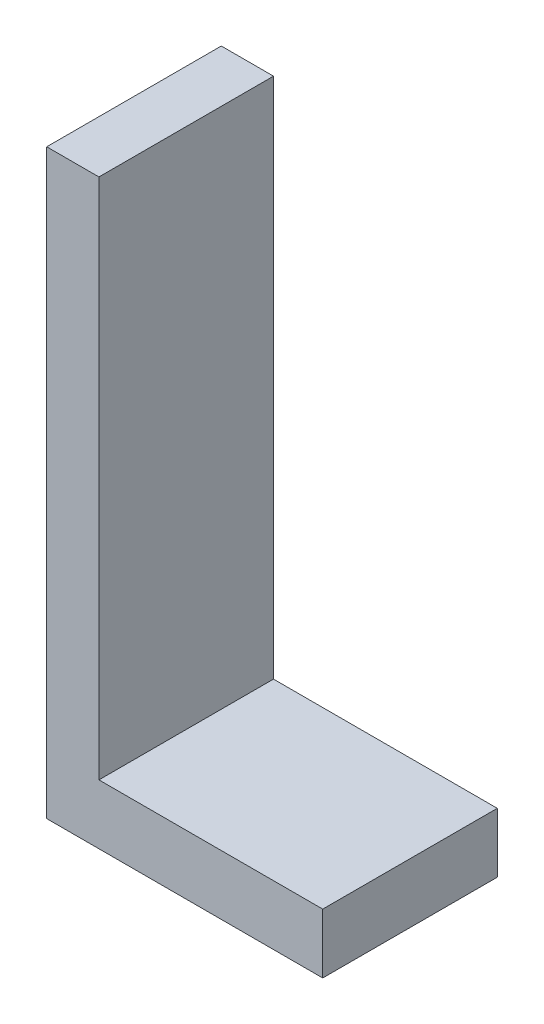
ISO-10303-21;
HEADER;
FILE_DESCRIPTION(('STEP AP214'),'2;1');
FILE_NAME('part.step','',(''),(''),'','','');
FILE_SCHEMA(('AUTOMOTIVE_DESIGN { 1 0 10303 214 1 1 1 1 }'));
ENDSEC;
DATA;
#1=APPLICATION_CONTEXT('core data for automotive mechanical design processes');
#2=APPLICATION_PROTOCOL_DEFINITION('international standard','automotive_design',2000,#1);
#3=PRODUCT_CONTEXT('',#1,'mechanical');
#4=PRODUCT('Part','Part','',(#3));
#5=PRODUCT_RELATED_PRODUCT_CATEGORY('part','',(#4));
#6=PRODUCT_DEFINITION_FORMATION('','',#4);
#7=PRODUCT_DEFINITION_CONTEXT('part definition',#1,'design');
#8=PRODUCT_DEFINITION('design','',#6,#7);
#9=PRODUCT_DEFINITION_SHAPE('','',#8);
#10=(LENGTH_UNIT() NAMED_UNIT(*) SI_UNIT(.MILLI.,.METRE.));
#11=(NAMED_UNIT(*) PLANE_ANGLE_UNIT() SI_UNIT($,.RADIAN.));
#12=(NAMED_UNIT(*) SI_UNIT($,.STERADIAN.) SOLID_ANGLE_UNIT());
#13=UNCERTAINTY_MEASURE_WITH_UNIT(LENGTH_MEASURE(1.E-05),#10,'distance_accuracy_value','');
#14=(GEOMETRIC_REPRESENTATION_CONTEXT(3) GLOBAL_UNCERTAINTY_ASSIGNED_CONTEXT((#13)) GLOBAL_UNIT_ASSIGNED_CONTEXT((#10,
#11,#12)) REPRESENTATION_CONTEXT('',''));
#15=CARTESIAN_POINT('',(0.,0.,0.));
#16=DIRECTION('',(0.,0.,1.));
#17=DIRECTION('',(1.,0.,0.));
#18=AXIS2_PLACEMENT_3D('',#15,#16,#17);
#19=CARTESIAN_POINT('',(-55.4324653258695,-22.8701190762308,1.5));
#20=DIRECTION('',(-1.,0.,0.));
#21=DIRECTION('',(0.,0.,1.));
#22=AXIS2_PLACEMENT_3D('',#19,#20,#21);
#23=PLANE('',#22);
#24=DIRECTION('',(0.,1.,0.));
#25=VECTOR('',#24,1.);
#26=CARTESIAN_POINT('',(-55.4324653258695,-22.8701190762308,0.));
#27=LINE('',#26,#25);
#28=CARTESIAN_POINT('',(-55.4324653258695,-22.8701190762308,0.));
#29=VERTEX_POINT('',#28);
#30=CARTESIAN_POINT('',(-55.4324653258695,-17.8701190762308,0.));
#31=VERTEX_POINT('',#30);
#32=EDGE_CURVE('E118',#29,#31,#27,.T.);
#33=ORIENTED_EDGE('',*,*,#32,.F.);
#34=DIRECTION('',(0.,0.,-1.));
#35=VECTOR('',#34,1.);
#36=CARTESIAN_POINT('',(-55.4324653258695,-22.8701190762308,1.5));
#37=LINE('',#36,#35);
#38=CARTESIAN_POINT('',(-55.4324653258695,-22.8701190762308,1.5));
#39=VERTEX_POINT('',#38);
#40=EDGE_CURVE('E11',#39,#29,#37,.T.);
#41=ORIENTED_EDGE('',*,*,#40,.F.);
#42=DIRECTION('',(0.,1.,0.));
#43=VECTOR('',#42,1.);
#44=CARTESIAN_POINT('',(-55.4324653258695,-22.8701190762308,1.5));
#45=LINE('',#44,#43);
#46=CARTESIAN_POINT('',(-55.4324653258695,-17.8701190762308,1.5));
#47=VERTEX_POINT('',#46);
#48=EDGE_CURVE('E132',#39,#47,#45,.T.);
#49=ORIENTED_EDGE('',*,*,#48,.T.);
#50=DIRECTION('',(0.,0.,-1.));
#51=VECTOR('',#50,1.);
#52=CARTESIAN_POINT('',(-55.4324653258695,-17.8701190762308,1.5));
#53=LINE('',#52,#51);
#54=EDGE_CURVE('E36',#47,#31,#53,.T.);
#55=ORIENTED_EDGE('',*,*,#54,.T.);
#56=EDGE_LOOP('',(#33,#41,#49,#55));
#57=FACE_BOUND('',#56,.T.);
#58=ADVANCED_FACE('F33',(#57),#23,.T.);
#59=CARTESIAN_POINT('',(-53.0606704540747,-22.8701190762308,1.5));
#60=DIRECTION('',(0.,-1.,0.));
#61=DIRECTION('',(0.,0.,-1.));
#62=AXIS2_PLACEMENT_3D('',#59,#60,#61);
#63=PLANE('',#62);
#64=DIRECTION('',(-1.,0.,0.));
#65=VECTOR('',#64,1.);
#66=CARTESIAN_POINT('',(-53.0606704540747,-22.8701190762308,0.));
#67=LINE('',#66,#65);
#68=CARTESIAN_POINT('',(-53.0606704540747,-22.8701190762308,0.));
#69=VERTEX_POINT('',#68);
#70=EDGE_CURVE('E130',#69,#29,#67,.T.);
#71=ORIENTED_EDGE('',*,*,#70,.F.);
#72=DIRECTION('',(0.,0.,-1.));
#73=VECTOR('',#72,1.);
#74=CARTESIAN_POINT('',(-53.0606704540747,-22.8701190762308,1.5));
#75=LINE('',#74,#73);
#76=CARTESIAN_POINT('',(-53.0606704540747,-22.8701190762308,1.5));
#77=VERTEX_POINT('',#76);
#78=EDGE_CURVE('E42',#77,#69,#75,.T.);
#79=ORIENTED_EDGE('',*,*,#78,.F.);
#80=DIRECTION('',(-1.,0.,0.));
#81=VECTOR('',#80,1.);
#82=CARTESIAN_POINT('',(-53.0606704540747,-22.8701190762308,1.5));
#83=LINE('',#82,#81);
#84=EDGE_CURVE('E108',#77,#39,#83,.T.);
#85=ORIENTED_EDGE('',*,*,#84,.T.);
#86=ORIENTED_EDGE('',*,*,#40,.T.);
#87=EDGE_LOOP('',(#71,#79,#85,#86));
#88=FACE_BOUND('',#87,.T.);
#89=ADVANCED_FACE('F140',(#88),#63,.T.);
#90=CARTESIAN_POINT('',(-53.0606704540747,-22.3572985634103,1.5));
#91=DIRECTION('',(1.,0.,0.));
#92=DIRECTION('',(0.,0.,-1.));
#93=AXIS2_PLACEMENT_3D('',#90,#91,#92);
#94=PLANE('',#93);
#95=DIRECTION('',(0.,-1.,0.));
#96=VECTOR('',#95,1.);
#97=CARTESIAN_POINT('',(-53.0606704540747,-22.3572985634103,0.));
#98=LINE('',#97,#96);
#99=CARTESIAN_POINT('',(-53.0606704540747,-22.3572985634103,0.));
#100=VERTEX_POINT('',#99);
#101=EDGE_CURVE('E95',#100,#69,#98,.T.);
#102=ORIENTED_EDGE('',*,*,#101,.F.);
#103=DIRECTION('',(0.,0.,-1.));
#104=VECTOR('',#103,1.);
#105=CARTESIAN_POINT('',(-53.0606704540747,-22.3572985634103,1.5));
#106=LINE('',#105,#104);
#107=CARTESIAN_POINT('',(-53.0606704540747,-22.3572985634103,1.5));
#108=VERTEX_POINT('',#107);
#109=EDGE_CURVE('E90',#108,#100,#106,.T.);
#110=ORIENTED_EDGE('',*,*,#109,.F.);
#111=DIRECTION('',(0.,-1.,0.));
#112=VECTOR('',#111,1.);
#113=CARTESIAN_POINT('',(-53.0606704540747,-22.3572985634103,1.5));
#114=LINE('',#113,#112);
#115=EDGE_CURVE('E93',#108,#77,#114,.T.);
#116=ORIENTED_EDGE('',*,*,#115,.T.);
#117=ORIENTED_EDGE('',*,*,#78,.T.);
#118=EDGE_LOOP('',(#102,#110,#116,#117));
#119=FACE_BOUND('',#118,.T.);
#120=ADVANCED_FACE('F92',(#119),#94,.T.);
#121=CARTESIAN_POINT('',(-54.9837473771516,-22.3572985634103,1.5));
#122=DIRECTION('',(0.,1.,0.));
#123=DIRECTION('',(0.,0.,1.));
#124=AXIS2_PLACEMENT_3D('',#121,#122,#123);
#125=PLANE('',#124);
#126=DIRECTION('',(1.,0.,0.));
#127=VECTOR('',#126,1.);
#128=CARTESIAN_POINT('',(-54.9837473771516,-22.3572985634103,0.));
#129=LINE('',#128,#127);
#130=CARTESIAN_POINT('',(-54.9837473771516,-22.3572985634103,0.));
#131=VERTEX_POINT('',#130);
#132=EDGE_CURVE('E127',#131,#100,#129,.T.);
#133=ORIENTED_EDGE('',*,*,#132,.F.);
#134=DIRECTION('',(0.,0.,-1.));
#135=VECTOR('',#134,1.);
#136=CARTESIAN_POINT('',(-54.9837473771516,-22.3572985634103,1.5));
#137=LINE('',#136,#135);
#138=CARTESIAN_POINT('',(-54.9837473771516,-22.3572985634103,1.5));
#139=VERTEX_POINT('',#138);
#140=EDGE_CURVE('E100',#139,#131,#137,.T.);
#141=ORIENTED_EDGE('',*,*,#140,.F.);
#142=DIRECTION('',(1.,0.,0.));
#143=VECTOR('',#142,1.);
#144=CARTESIAN_POINT('',(-54.9837473771516,-22.3572985634103,1.5));
#145=LINE('',#144,#143);
#146=EDGE_CURVE('E106',#139,#108,#145,.T.);
#147=ORIENTED_EDGE('',*,*,#146,.T.);
#148=ORIENTED_EDGE('',*,*,#109,.T.);
#149=EDGE_LOOP('',(#133,#141,#147,#148));
#150=FACE_BOUND('',#149,.T.);
#151=ADVANCED_FACE('F110',(#150),#125,.T.);
#152=CARTESIAN_POINT('',(-54.9837473771516,-17.8701190762308,1.5));
#153=DIRECTION('',(1.,0.,0.));
#154=DIRECTION('',(0.,0.,-1.));
#155=AXIS2_PLACEMENT_3D('',#152,#153,#154);
#156=PLANE('',#155);
#157=DIRECTION('',(0.,-1.,0.));
#158=VECTOR('',#157,1.);
#159=CARTESIAN_POINT('',(-54.9837473771516,-17.8701190762308,0.));
#160=LINE('',#159,#158);
#161=CARTESIAN_POINT('',(-54.9837473771516,-17.8701190762308,0.));
#162=VERTEX_POINT('',#161);
#163=EDGE_CURVE('E124',#162,#131,#160,.T.);
#164=ORIENTED_EDGE('',*,*,#163,.F.);
#165=DIRECTION('',(0.,0.,-1.));
#166=VECTOR('',#165,1.);
#167=CARTESIAN_POINT('',(-54.9837473771516,-17.8701190762308,1.5));
#168=LINE('',#167,#166);
#169=CARTESIAN_POINT('',(-54.9837473771516,-17.8701190762308,1.5));
#170=VERTEX_POINT('',#169);
#171=EDGE_CURVE('E135',#170,#162,#168,.T.);
#172=ORIENTED_EDGE('',*,*,#171,.F.);
#173=DIRECTION('',(0.,-1.,0.));
#174=VECTOR('',#173,1.);
#175=CARTESIAN_POINT('',(-54.9837473771516,-17.8701190762308,1.5));
#176=LINE('',#175,#174);
#177=EDGE_CURVE('E111',#170,#139,#176,.T.);
#178=ORIENTED_EDGE('',*,*,#177,.T.);
#179=ORIENTED_EDGE('',*,*,#140,.T.);
#180=EDGE_LOOP('',(#164,#172,#178,#179));
#181=FACE_BOUND('',#180,.T.);
#182=ADVANCED_FACE('F153',(#181),#156,.T.);
#183=CARTESIAN_POINT('',(-55.4324653258695,-17.8701190762308,1.5));
#184=DIRECTION('',(0.,1.,0.));
#185=DIRECTION('',(0.,0.,1.));
#186=AXIS2_PLACEMENT_3D('',#183,#184,#185);
#187=PLANE('',#186);
#188=DIRECTION('',(1.,0.,0.));
#189=VECTOR('',#188,1.);
#190=CARTESIAN_POINT('',(-55.4324653258695,-17.8701190762308,0.));
#191=LINE('',#190,#189);
#192=EDGE_CURVE('E121',#31,#162,#191,.T.);
#193=ORIENTED_EDGE('',*,*,#192,.F.);
#194=ORIENTED_EDGE('',*,*,#54,.F.);
#195=DIRECTION('',(1.,0.,0.));
#196=VECTOR('',#195,1.);
#197=CARTESIAN_POINT('',(-55.4324653258695,-17.8701190762308,1.5));
#198=LINE('',#197,#196);
#199=EDGE_CURVE('E113',#47,#170,#198,.T.);
#200=ORIENTED_EDGE('',*,*,#199,.T.);
#201=ORIENTED_EDGE('',*,*,#171,.T.);
#202=EDGE_LOOP('',(#193,#194,#200,#201));
#203=FACE_BOUND('',#202,.T.);
#204=ADVANCED_FACE('F137',(#203),#187,.T.);
#205=CARTESIAN_POINT('',(0.,0.,1.5));
#206=DIRECTION('',(0.,0.,-1.));
#207=DIRECTION('',(-1.,0.,0.));
#208=AXIS2_PLACEMENT_3D('',#205,#206,#207);
#209=PLANE('',#208);
#210=ORIENTED_EDGE('',*,*,#48,.F.);
#211=ORIENTED_EDGE('',*,*,#84,.F.);
#212=ORIENTED_EDGE('',*,*,#115,.F.);
#213=ORIENTED_EDGE('',*,*,#146,.F.);
#214=ORIENTED_EDGE('',*,*,#177,.F.);
#215=ORIENTED_EDGE('',*,*,#199,.F.);
#216=EDGE_LOOP('',(#210,#211,#212,#213,#214,#215));
#217=FACE_BOUND('',#216,.T.);
#218=ADVANCED_FACE('F104',(#217),#209,.F.);
#219=CARTESIAN_POINT('',(0.,0.,0.));
#220=DIRECTION('',(0.,0.,-1.));
#221=DIRECTION('',(-1.,0.,0.));
#222=AXIS2_PLACEMENT_3D('',#219,#220,#221);
#223=PLANE('',#222);
#224=ORIENTED_EDGE('',*,*,#32,.T.);
#225=ORIENTED_EDGE('',*,*,#192,.T.);
#226=ORIENTED_EDGE('',*,*,#163,.T.);
#227=ORIENTED_EDGE('',*,*,#132,.T.);
#228=ORIENTED_EDGE('',*,*,#101,.T.);
#229=ORIENTED_EDGE('',*,*,#70,.T.);
#230=EDGE_LOOP('',(#224,#225,#226,#227,#228,#229));
#231=FACE_BOUND('',#230,.T.);
#232=ADVANCED_FACE('F139',(#231),#223,.T.);
#233=CLOSED_SHELL('',(#58,#89,#120,#151,#182,#204,#218,#232));
#234=MANIFOLD_SOLID_BREP('B2',#233);
#235=ADVANCED_BREP_SHAPE_REPRESENTATION('',(#18,#234),#14);
#236=SHAPE_DEFINITION_REPRESENTATION(#9,#235);
ENDSEC;
END-ISO-10303-21;
